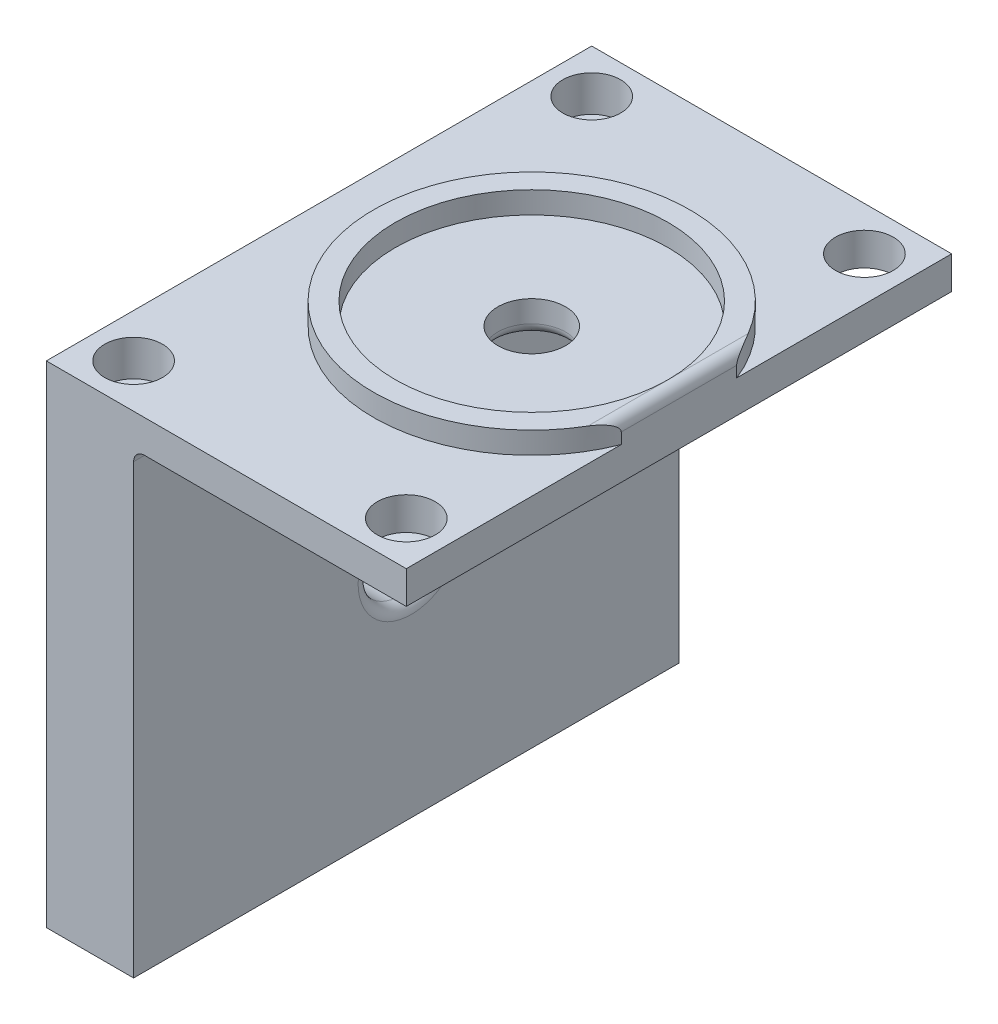
ISO-10303-21;
HEADER;
FILE_DESCRIPTION(('STEP AP214'),'2;1');
FILE_NAME('part.step','',(''),(''),'','','');
FILE_SCHEMA(('AUTOMOTIVE_DESIGN { 1 0 10303 214 1 1 1 1 }'));
ENDSEC;
DATA;
#1=APPLICATION_CONTEXT('core data for automotive mechanical design processes');
#2=APPLICATION_PROTOCOL_DEFINITION('international standard','automotive_design',2000,#1);
#3=PRODUCT_CONTEXT('',#1,'mechanical');
#4=PRODUCT('Part','Part','',(#3));
#5=PRODUCT_RELATED_PRODUCT_CATEGORY('part','',(#4));
#6=PRODUCT_DEFINITION_FORMATION('','',#4);
#7=PRODUCT_DEFINITION_CONTEXT('part definition',#1,'design');
#8=PRODUCT_DEFINITION('design','',#6,#7);
#9=PRODUCT_DEFINITION_SHAPE('','',#8);
#10=(LENGTH_UNIT() NAMED_UNIT(*) SI_UNIT(.MILLI.,.METRE.));
#11=(NAMED_UNIT(*) PLANE_ANGLE_UNIT() SI_UNIT($,.RADIAN.));
#12=(NAMED_UNIT(*) SI_UNIT($,.STERADIAN.) SOLID_ANGLE_UNIT());
#13=UNCERTAINTY_MEASURE_WITH_UNIT(LENGTH_MEASURE(1.E-05),#10,'distance_accuracy_value','');
#14=(GEOMETRIC_REPRESENTATION_CONTEXT(3) GLOBAL_UNCERTAINTY_ASSIGNED_CONTEXT((#13)) GLOBAL_UNIT_ASSIGNED_CONTEXT((#10,
#11,#12)) REPRESENTATION_CONTEXT('',''));
#15=CARTESIAN_POINT('',(0.,0.,0.));
#16=DIRECTION('',(0.,0.,1.));
#17=DIRECTION('',(1.,0.,0.));
#18=AXIS2_PLACEMENT_3D('',#15,#16,#17);
#19=CARTESIAN_POINT('',(0.,3.,0.));
#20=DIRECTION('',(0.,1.,0.));
#21=DIRECTION('',(0.,0.,1.));
#22=AXIS2_PLACEMENT_3D('',#19,#20,#21);
#23=PLANE('',#22);
#24=CARTESIAN_POINT('',(1.27695167286245,3.,-11.3847583643123));
#25=DIRECTION('',(0.,1.,0.));
#26=DIRECTION('',(0.,0.,1.));
#27=AXIS2_PLACEMENT_3D('',#24,#25,#26);
#28=CIRCLE('',#27,3.1);
#29=CARTESIAN_POINT('',(1.27695167286245,3.,-8.28475836431227));
#30=VERTEX_POINT('',#29);
#31=EDGE_CURVE('E243',#30,#30,#28,.T.);
#32=ORIENTED_EDGE('',*,*,#31,.F.);
#33=EDGE_LOOP('',(#32));
#34=FACE_BOUND('',#33,.T.);
#35=CARTESIAN_POINT('',(1.27695167286245,3.,-11.3847583643123));
#36=DIRECTION('',(0.,1.,0.));
#37=DIRECTION('',(0.,0.,1.));
#38=AXIS2_PLACEMENT_3D('',#35,#36,#37);
#39=CIRCLE('',#38,12.5);
#40=CARTESIAN_POINT('',(1.27695167286245,3.,1.11524163568773));
#41=VERTEX_POINT('',#40);
#42=EDGE_CURVE('E146',#41,#41,#39,.T.);
#43=ORIENTED_EDGE('',*,*,#42,.T.);
#44=EDGE_LOOP('',(#43));
#45=FACE_BOUND('',#44,.T.);
#46=ADVANCED_FACE('F41',(#34,#45),#23,.T.);
#47=CARTESIAN_POINT('',(0.,0.,0.));
#48=DIRECTION('',(0.,1.,0.));
#49=DIRECTION('',(0.,0.,1.));
#50=AXIS2_PLACEMENT_3D('',#47,#48,#49);
#51=PLANE('',#50);
#52=CARTESIAN_POINT('',(10.7769516728624,0.,-32.3847583643123));
#53=DIRECTION('',(0.,1.,0.));
#54=DIRECTION('',(0.,0.,1.));
#55=AXIS2_PLACEMENT_3D('',#52,#53,#54);
#56=CIRCLE('',#55,2.65);
#57=CARTESIAN_POINT('',(10.7769516728624,0.,-29.7347583643123));
#58=VERTEX_POINT('',#57);
#59=EDGE_CURVE('E170',#58,#58,#56,.F.);
#60=ORIENTED_EDGE('',*,*,#59,.F.);
#61=EDGE_LOOP('',(#60));
#62=FACE_BOUND('',#61,.T.);
#63=CARTESIAN_POINT('',(10.7769516728625,0.,9.61524163568773));
#64=DIRECTION('',(0.,1.,0.));
#65=DIRECTION('',(0.,0.,1.));
#66=AXIS2_PLACEMENT_3D('',#63,#64,#65);
#67=CIRCLE('',#66,2.65);
#68=CARTESIAN_POINT('',(10.7769516728625,0.,12.2652416356877));
#69=VERTEX_POINT('',#68);
#70=EDGE_CURVE('E163',#69,#69,#67,.F.);
#71=ORIENTED_EDGE('',*,*,#70,.F.);
#72=EDGE_LOOP('',(#71));
#73=FACE_BOUND('',#72,.T.);
#74=CARTESIAN_POINT('',(1.27695167286245,0.,-11.3847583643123));
#75=DIRECTION('',(0.,1.,0.));
#76=DIRECTION('',(0.,0.,1.));
#77=AXIS2_PLACEMENT_3D('',#74,#75,#76);
#78=CIRCLE('',#77,4.1);
#79=CARTESIAN_POINT('',(1.27695167286245,0.,-7.28475836431227));
#80=VERTEX_POINT('',#79);
#81=EDGE_CURVE('E268',#80,#80,#78,.T.);
#82=ORIENTED_EDGE('',*,*,#81,.T.);
#83=EDGE_LOOP('',(#82));
#84=FACE_BOUND('',#83,.T.);
#85=DIRECTION('',(1.,0.,0.));
#86=VECTOR('',#85,1.);
#87=CARTESIAN_POINT('',(-10.2230483271375,0.,13.6152416356877));
#88=LINE('',#87,#86);
#89=CARTESIAN_POINT('',(-9.22304832713755,0.,13.6152416356877));
#90=VERTEX_POINT('',#89);
#91=CARTESIAN_POINT('',(14.7769516728625,0.,13.6152416356877));
#92=VERTEX_POINT('',#91);
#93=EDGE_CURVE('E247',#90,#92,#88,.T.);
#94=ORIENTED_EDGE('',*,*,#93,.F.);
#95=DIRECTION('',(0.,0.,1.));
#96=VECTOR('',#95,1.);
#97=CARTESIAN_POINT('',(-9.22304832713755,0.,-36.3847583643123));
#98=LINE('',#97,#96);
#99=CARTESIAN_POINT('',(-9.22304832713755,0.,-36.3847583643123));
#100=VERTEX_POINT('',#99);
#101=EDGE_CURVE('E288',#90,#100,#98,.F.);
#102=ORIENTED_EDGE('',*,*,#101,.T.);
#103=DIRECTION('',(-1.,0.,0.));
#104=VECTOR('',#103,1.);
#105=CARTESIAN_POINT('',(-10.2230483271376,0.,-36.3847583643123));
#106=LINE('',#105,#104);
#107=CARTESIAN_POINT('',(14.7769516728625,0.,-36.3847583643123));
#108=VERTEX_POINT('',#107);
#109=EDGE_CURVE('E249',#108,#100,#106,.T.);
#110=ORIENTED_EDGE('',*,*,#109,.F.);
#111=DIRECTION('',(0.,0.,-1.));
#112=VECTOR('',#111,1.);
#113=CARTESIAN_POINT('',(14.7769516728625,0.,-36.3847583643123));
#114=LINE('',#113,#112);
#115=EDGE_CURVE('E256',#92,#108,#114,.T.);
#116=ORIENTED_EDGE('',*,*,#115,.F.);
#117=EDGE_LOOP('',(#94,#102,#110,#116));
#118=FACE_BOUND('',#117,.T.);
#119=ADVANCED_FACE('F391',(#62,#73,#84,#118),#51,.F.);
#120=CARTESIAN_POINT('',(1.27695167286245,3.,-11.3847583643123));
#121=DIRECTION('',(0.,1.,0.));
#122=DIRECTION('',(0.,0.,1.));
#123=AXIS2_PLACEMENT_3D('',#120,#121,#122);
#124=CIRCLE('',#123,14.5);
#125=CARTESIAN_POINT('',(14.7769516728625,3.,-16.6762609864415));
#126=VERTEX_POINT('',#125);
#127=CARTESIAN_POINT('',(14.7769516728625,3.,-6.0932557421831));
#128=VERTEX_POINT('',#127);
#129=EDGE_CURVE('E134',#126,#128,#124,.T.);
#130=ORIENTED_EDGE('',*,*,#129,.F.);
#131=DIRECTION('',(0.,0.,-1.));
#132=VECTOR('',#131,1.);
#133=CARTESIAN_POINT('',(14.7769516728625,3.,-36.3847583643123));
#134=LINE('',#133,#132);
#135=CARTESIAN_POINT('',(14.7769516728625,3.,-36.3847583643123));
#136=VERTEX_POINT('',#135);
#137=EDGE_CURVE('E141',#126,#136,#134,.T.);
#138=ORIENTED_EDGE('',*,*,#137,.T.);
#139=DIRECTION('',(-1.,0.,0.));
#140=VECTOR('',#139,1.);
#141=CARTESIAN_POINT('',(-10.2230483271376,3.,-36.3847583643123));
#142=LINE('',#141,#140);
#143=CARTESIAN_POINT('',(-18.2230483271376,3.,-36.3847583643123));
#144=VERTEX_POINT('',#143);
#145=EDGE_CURVE('E140',#136,#144,#142,.T.);
#146=ORIENTED_EDGE('',*,*,#145,.T.);
#147=DIRECTION('',(0.,0.,-1.));
#148=VECTOR('',#147,1.);
#149=CARTESIAN_POINT('',(-18.2230483271376,3.,-36.3847583643123));
#150=LINE('',#149,#148);
#151=CARTESIAN_POINT('',(-18.2230483271375,3.,13.6152416356877));
#152=VERTEX_POINT('',#151);
#153=EDGE_CURVE('E239',#152,#144,#150,.T.);
#154=ORIENTED_EDGE('',*,*,#153,.F.);
#155=DIRECTION('',(1.,0.,0.));
#156=VECTOR('',#155,1.);
#157=CARTESIAN_POINT('',(-10.2230483271375,3.,13.6152416356877));
#158=LINE('',#157,#156);
#159=CARTESIAN_POINT('',(14.7769516728625,3.,13.6152416356877));
#160=VERTEX_POINT('',#159);
#161=EDGE_CURVE('E137',#152,#160,#158,.T.);
#162=ORIENTED_EDGE('',*,*,#161,.T.);
#163=EDGE_CURVE('E123',#160,#128,#134,.T.);
#164=ORIENTED_EDGE('',*,*,#163,.T.);
#165=EDGE_LOOP('',(#130,#138,#146,#154,#162,#164));
#166=FACE_BOUND('',#165,.T.);
#167=CARTESIAN_POINT('',(10.7769516728624,3.,-32.3847583643123));
#168=DIRECTION('',(0.,-1.,0.));
#169=DIRECTION('',(0.,0.,1.));
#170=AXIS2_PLACEMENT_3D('',#167,#168,#169);
#171=CIRCLE('',#170,2.65);
#172=CARTESIAN_POINT('',(10.7769516728624,3.,-29.7347583643123));
#173=VERTEX_POINT('',#172);
#174=EDGE_CURVE('E159',#173,#173,#171,.T.);
#175=ORIENTED_EDGE('',*,*,#174,.T.);
#176=EDGE_LOOP('',(#175));
#177=FACE_BOUND('',#176,.T.);
#178=CARTESIAN_POINT('',(10.7769516728625,3.,9.61524163568773));
#179=DIRECTION('',(0.,-1.,0.));
#180=DIRECTION('',(0.,0.,1.));
#181=AXIS2_PLACEMENT_3D('',#178,#179,#180);
#182=CIRCLE('',#181,2.65);
#183=CARTESIAN_POINT('',(10.7769516728625,3.,12.2652416356877));
#184=VERTEX_POINT('',#183);
#185=EDGE_CURVE('E158',#184,#184,#182,.T.);
#186=ORIENTED_EDGE('',*,*,#185,.T.);
#187=EDGE_LOOP('',(#186));
#188=FACE_BOUND('',#187,.T.);
#189=CARTESIAN_POINT('',(-14.2230483271375,3.,-32.3847583643123));
#190=DIRECTION('',(0.,1.,0.));
#191=DIRECTION('',(0.,0.,1.));
#192=AXIS2_PLACEMENT_3D('',#189,#190,#191);
#193=CIRCLE('',#192,2.65);
#194=CARTESIAN_POINT('',(-14.2230483271375,3.,-29.7347583643123));
#195=VERTEX_POINT('',#194);
#196=EDGE_CURVE('E200',#195,#195,#193,.T.);
#197=ORIENTED_EDGE('',*,*,#196,.F.);
#198=EDGE_LOOP('',(#197));
#199=FACE_BOUND('',#198,.T.);
#200=CARTESIAN_POINT('',(-14.2230483271375,3.,9.61524163568773));
#201=DIRECTION('',(0.,1.,0.));
#202=DIRECTION('',(0.,0.,1.));
#203=AXIS2_PLACEMENT_3D('',#200,#201,#202);
#204=CIRCLE('',#203,2.65);
#205=CARTESIAN_POINT('',(-14.2230483271375,3.,12.2652416356877));
#206=VERTEX_POINT('',#205);
#207=EDGE_CURVE('E183',#206,#206,#204,.T.);
#208=ORIENTED_EDGE('',*,*,#207,.F.);
#209=EDGE_LOOP('',(#208));
#210=FACE_BOUND('',#209,.T.);
#211=ADVANCED_FACE('F132',(#166,#177,#188,#199,#210),#23,.T.);
#212=CARTESIAN_POINT('',(-10.2230483271375,3.,13.6152416356877));
#213=DIRECTION('',(0.,0.,-1.));
#214=DIRECTION('',(-1.,0.,0.));
#215=AXIS2_PLACEMENT_3D('',#212,#213,#214);
#216=PLANE('',#215);
#217=DIRECTION('',(0.,1.,0.));
#218=VECTOR('',#217,1.);
#219=CARTESIAN_POINT('',(-18.2230483271375,3.,13.6152416356877));
#220=LINE('',#219,#218);
#221=CARTESIAN_POINT('',(-18.2230483271376,-42.,13.6152416356877));
#222=VERTEX_POINT('',#221);
#223=EDGE_CURVE('E235',#222,#152,#220,.T.);
#224=ORIENTED_EDGE('',*,*,#223,.F.);
#225=DIRECTION('',(-1.,0.,0.));
#226=VECTOR('',#225,1.);
#227=CARTESIAN_POINT('',(-18.2230483271376,-42.,13.6152416356877));
#228=LINE('',#227,#226);
#229=CARTESIAN_POINT('',(-10.2230483271376,-42.,13.6152416356877));
#230=VERTEX_POINT('',#229);
#231=EDGE_CURVE('E220',#230,#222,#228,.T.);
#232=ORIENTED_EDGE('',*,*,#231,.F.);
#233=DIRECTION('',(0.,1.,0.));
#234=VECTOR('',#233,1.);
#235=CARTESIAN_POINT('',(-10.2230483271376,-42.,13.6152416356877));
#236=LINE('',#235,#234);
#237=CARTESIAN_POINT('',(-10.2230483271376,-1.00000000000001,13.6152416356877));
#238=VERTEX_POINT('',#237);
#239=EDGE_CURVE('E224',#230,#238,#236,.T.);
#240=ORIENTED_EDGE('',*,*,#239,.T.);
#241=CARTESIAN_POINT('',(-9.22304832713755,-1.,13.6152416356877));
#242=DIRECTION('',(0.,0.,-1.));
#243=DIRECTION('',(-1.,0.,0.));
#244=AXIS2_PLACEMENT_3D('',#241,#242,#243);
#245=CIRCLE('',#244,1.);
#246=EDGE_CURVE('E291',#238,#90,#245,.T.);
#247=ORIENTED_EDGE('',*,*,#246,.T.);
#248=ORIENTED_EDGE('',*,*,#93,.T.);
#249=DIRECTION('',(0.,-1.,0.));
#250=VECTOR('',#249,1.);
#251=CARTESIAN_POINT('',(14.7769516728625,3.,13.6152416356877));
#252=LINE('',#251,#250);
#253=EDGE_CURVE('E265',#160,#92,#252,.T.);
#254=ORIENTED_EDGE('',*,*,#253,.F.);
#255=ORIENTED_EDGE('',*,*,#161,.F.);
#256=EDGE_LOOP('',(#224,#232,#240,#247,#248,#254,#255));
#257=FACE_BOUND('',#256,.T.);
#258=ADVANCED_FACE('F390',(#257),#216,.F.);
#259=CARTESIAN_POINT('',(14.7769516728625,3.,-36.3847583643123));
#260=DIRECTION('',(-1.,0.,0.));
#261=DIRECTION('',(0.,0.,1.));
#262=AXIS2_PLACEMENT_3D('',#259,#260,#261);
#263=PLANE('',#262);
#264=DIRECTION('',(0.,-1.,0.));
#265=VECTOR('',#264,1.);
#266=CARTESIAN_POINT('',(14.7769516728625,5.,-16.6762609864414));
#267=LINE('',#266,#265);
#268=CARTESIAN_POINT('',(14.7769516728625,4.,-16.6762609864414));
#269=VERTEX_POINT('',#268);
#270=EDGE_CURVE('E127',#269,#126,#267,.T.);
#271=ORIENTED_EDGE('',*,*,#270,.F.);
#272=DIRECTION('',(0.,0.,-1.));
#273=VECTOR('',#272,1.);
#274=CARTESIAN_POINT('',(14.7769516728625,4.,-6.0932557421831));
#275=LINE('',#274,#273);
#276=CARTESIAN_POINT('',(14.7769516728625,4.,-6.0932557421831));
#277=VERTEX_POINT('',#276);
#278=EDGE_CURVE('E11',#269,#277,#275,.F.);
#279=ORIENTED_EDGE('',*,*,#278,.T.);
#280=DIRECTION('',(0.,-1.,0.));
#281=VECTOR('',#280,1.);
#282=CARTESIAN_POINT('',(14.7769516728625,5.,-6.0932557421831));
#283=LINE('',#282,#281);
#284=EDGE_CURVE('E119',#277,#128,#283,.T.);
#285=ORIENTED_EDGE('',*,*,#284,.T.);
#286=ORIENTED_EDGE('',*,*,#163,.F.);
#287=ORIENTED_EDGE('',*,*,#253,.T.);
#288=ORIENTED_EDGE('',*,*,#115,.T.);
#289=DIRECTION('',(0.,-1.,0.));
#290=VECTOR('',#289,1.);
#291=CARTESIAN_POINT('',(14.7769516728625,3.,-36.3847583643123));
#292=LINE('',#291,#290);
#293=EDGE_CURVE('E253',#136,#108,#292,.T.);
#294=ORIENTED_EDGE('',*,*,#293,.F.);
#295=ORIENTED_EDGE('',*,*,#137,.F.);
#296=EDGE_LOOP('',(#271,#279,#285,#286,#287,#288,#294,#295));
#297=FACE_BOUND('',#296,.T.);
#298=ADVANCED_FACE('F121',(#297),#263,.F.);
#299=CARTESIAN_POINT('',(-10.2230483271376,3.,-36.3847583643123));
#300=DIRECTION('',(0.,0.,1.));
#301=DIRECTION('',(1.,0.,0.));
#302=AXIS2_PLACEMENT_3D('',#299,#300,#301);
#303=PLANE('',#302);
#304=ORIENTED_EDGE('',*,*,#109,.T.);
#305=CARTESIAN_POINT('',(-9.22304832713755,-1.,-36.3847583643123));
#306=DIRECTION('',(0.,0.,1.));
#307=DIRECTION('',(1.,0.,0.));
#308=AXIS2_PLACEMENT_3D('',#305,#306,#307);
#309=CIRCLE('',#308,1.);
#310=CARTESIAN_POINT('',(-10.2230483271376,-1.00000000000001,-36.3847583643123));
#311=VERTEX_POINT('',#310);
#312=EDGE_CURVE('E294',#100,#311,#309,.T.);
#313=ORIENTED_EDGE('',*,*,#312,.T.);
#314=DIRECTION('',(0.,1.,0.));
#315=VECTOR('',#314,1.);
#316=CARTESIAN_POINT('',(-10.2230483271376,-42.,-36.3847583643123));
#317=LINE('',#316,#315);
#318=CARTESIAN_POINT('',(-10.2230483271376,-42.,-36.3847583643123));
#319=VERTEX_POINT('',#318);
#320=EDGE_CURVE('E228',#319,#311,#317,.T.);
#321=ORIENTED_EDGE('',*,*,#320,.F.);
#322=DIRECTION('',(1.,0.,0.));
#323=VECTOR('',#322,1.);
#324=CARTESIAN_POINT('',(-18.2230483271376,-42.,-36.3847583643123));
#325=LINE('',#324,#323);
#326=CARTESIAN_POINT('',(-18.2230483271376,-42.,-36.3847583643123));
#327=VERTEX_POINT('',#326);
#328=EDGE_CURVE('E214',#327,#319,#325,.T.);
#329=ORIENTED_EDGE('',*,*,#328,.F.);
#330=DIRECTION('',(0.,-1.,0.));
#331=VECTOR('',#330,1.);
#332=CARTESIAN_POINT('',(-18.2230483271376,3.,-36.3847583643123));
#333=LINE('',#332,#331);
#334=EDGE_CURVE('E232',#144,#327,#333,.T.);
#335=ORIENTED_EDGE('',*,*,#334,.F.);
#336=ORIENTED_EDGE('',*,*,#145,.F.);
#337=ORIENTED_EDGE('',*,*,#293,.T.);
#338=EDGE_LOOP('',(#304,#313,#321,#329,#335,#336,#337));
#339=FACE_BOUND('',#338,.T.);
#340=ADVANCED_FACE('F386',(#339),#303,.F.);
#341=CARTESIAN_POINT('',(1.27695167286245,3.,-11.3847583643123));
#342=DIRECTION('',(0.,-1.,0.));
#343=DIRECTION('',(0.,0.,-1.));
#344=AXIS2_PLACEMENT_3D('',#341,#342,#343);
#345=CYLINDRICAL_SURFACE('',#344,3.1);
#346=CARTESIAN_POINT('',(1.27695167286245,1.,-11.3847583643123));
#347=DIRECTION('',(0.,1.,0.));
#348=DIRECTION('',(0.,0.,1.));
#349=AXIS2_PLACEMENT_3D('',#346,#347,#348);
#350=CIRCLE('',#349,3.1);
#351=CARTESIAN_POINT('',(1.27695167286245,1.,-8.28475836431227));
#352=VERTEX_POINT('',#351);
#353=EDGE_CURVE('E272',#352,#352,#350,.F.);
#354=ORIENTED_EDGE('',*,*,#353,.T.);
#355=EDGE_LOOP('',(#354));
#356=FACE_BOUND('',#355,.T.);
#357=ORIENTED_EDGE('',*,*,#31,.T.);
#358=EDGE_LOOP('',(#357));
#359=FACE_BOUND('',#358,.T.);
#360=ADVANCED_FACE('F382',(#356,#359),#345,.F.);
#361=CARTESIAN_POINT('',(-18.2230483271375,0.,0.));
#362=DIRECTION('',(-1.,0.,0.));
#363=DIRECTION('',(0.,0.,1.));
#364=AXIS2_PLACEMENT_3D('',#361,#362,#363);
#365=PLANE('',#364);
#366=CARTESIAN_POINT('',(-18.2230483271375,-21.,-11.836279123996));
#367=DIRECTION('',(-1.,0.,0.));
#368=DIRECTION('',(0.,0.,1.));
#369=AXIS2_PLACEMENT_3D('',#366,#367,#368);
#370=CIRCLE('',#369,3.8682468035705);
#371=CARTESIAN_POINT('',(-18.2230483271375,-21.,-7.96803232042551));
#372=VERTEX_POINT('',#371);
#373=EDGE_CURVE('E174',#372,#372,#370,.T.);
#374=ORIENTED_EDGE('',*,*,#373,.F.);
#375=EDGE_LOOP('',(#374));
#376=FACE_BOUND('',#375,.T.);
#377=ORIENTED_EDGE('',*,*,#334,.T.);
#378=DIRECTION('',(0.,0.,-1.));
#379=VECTOR('',#378,1.);
#380=CARTESIAN_POINT('',(-18.2230483271376,-42.,-36.3847583643123));
#381=LINE('',#380,#379);
#382=EDGE_CURVE('E199',#222,#327,#381,.T.);
#383=ORIENTED_EDGE('',*,*,#382,.F.);
#384=ORIENTED_EDGE('',*,*,#223,.T.);
#385=ORIENTED_EDGE('',*,*,#153,.T.);
#386=EDGE_LOOP('',(#377,#383,#384,#385));
#387=FACE_BOUND('',#386,.T.);
#388=ADVANCED_FACE('F378',(#376,#387),#365,.T.);
#389=CARTESIAN_POINT('',(-10.2230483271376,-42.,-36.3847583643123));
#390=DIRECTION('',(-1.,0.,0.));
#391=DIRECTION('',(0.,0.,1.));
#392=AXIS2_PLACEMENT_3D('',#389,#390,#391);
#393=PLANE('',#392);
#394=CARTESIAN_POINT('',(-10.2230483271376,-21.,-11.836279123996));
#395=DIRECTION('',(-1.,0.,0.));
#396=DIRECTION('',(0.,0.,1.));
#397=AXIS2_PLACEMENT_3D('',#394,#395,#396);
#398=CIRCLE('',#397,4.86824680357049);
#399=CARTESIAN_POINT('',(-10.2230483271376,-21.,-6.96803232042551));
#400=VERTEX_POINT('',#399);
#401=EDGE_CURVE('E276',#400,#400,#398,.T.);
#402=ORIENTED_EDGE('',*,*,#401,.T.);
#403=EDGE_LOOP('',(#402));
#404=FACE_BOUND('',#403,.T.);
#405=ORIENTED_EDGE('',*,*,#320,.T.);
#406=DIRECTION('',(0.,0.,1.));
#407=VECTOR('',#406,1.);
#408=CARTESIAN_POINT('',(-10.2230483271376,-1.,13.6152416356877));
#409=LINE('',#408,#407);
#410=EDGE_CURVE('E284',#311,#238,#409,.T.);
#411=ORIENTED_EDGE('',*,*,#410,.T.);
#412=ORIENTED_EDGE('',*,*,#239,.F.);
#413=DIRECTION('',(0.,0.,1.));
#414=VECTOR('',#413,1.);
#415=CARTESIAN_POINT('',(-10.2230483271376,-42.,-36.3847583643123));
#416=LINE('',#415,#414);
#417=EDGE_CURVE('E217',#319,#230,#416,.T.);
#418=ORIENTED_EDGE('',*,*,#417,.F.);
#419=EDGE_LOOP('',(#405,#411,#412,#418));
#420=FACE_BOUND('',#419,.T.);
#421=ADVANCED_FACE('F374',(#404,#420),#393,.F.);
#422=CARTESIAN_POINT('',(0.,-42.,0.));
#423=DIRECTION('',(0.,1.,0.));
#424=DIRECTION('',(0.,0.,1.));
#425=AXIS2_PLACEMENT_3D('',#422,#423,#424);
#426=PLANE('',#425);
#427=CARTESIAN_POINT('',(-14.2230483271375,-42.,-32.3847583643123));
#428=DIRECTION('',(0.,1.,0.));
#429=DIRECTION('',(0.,0.,1.));
#430=AXIS2_PLACEMENT_3D('',#427,#428,#429);
#431=CIRCLE('',#430,2.65);
#432=CARTESIAN_POINT('',(-14.2230483271375,-42.,-29.7347583643123));
#433=VERTEX_POINT('',#432);
#434=EDGE_CURVE('E184',#433,#433,#431,.T.);
#435=ORIENTED_EDGE('',*,*,#434,.T.);
#436=EDGE_LOOP('',(#435));
#437=FACE_BOUND('',#436,.T.);
#438=CARTESIAN_POINT('',(-14.2230483271375,-42.,9.61524163568773));
#439=DIRECTION('',(0.,1.,0.));
#440=DIRECTION('',(0.,0.,1.));
#441=AXIS2_PLACEMENT_3D('',#438,#439,#440);
#442=CIRCLE('',#441,2.65);
#443=CARTESIAN_POINT('',(-14.2230483271375,-42.,12.2652416356877));
#444=VERTEX_POINT('',#443);
#445=EDGE_CURVE('E178',#444,#444,#442,.T.);
#446=ORIENTED_EDGE('',*,*,#445,.T.);
#447=EDGE_LOOP('',(#446));
#448=FACE_BOUND('',#447,.T.);
#449=ORIENTED_EDGE('',*,*,#382,.T.);
#450=ORIENTED_EDGE('',*,*,#328,.T.);
#451=ORIENTED_EDGE('',*,*,#417,.T.);
#452=ORIENTED_EDGE('',*,*,#231,.T.);
#453=EDGE_LOOP('',(#449,#450,#451,#452));
#454=FACE_BOUND('',#453,.T.);
#455=ADVANCED_FACE('F370',(#437,#448,#454),#426,.F.);
#456=CARTESIAN_POINT('',(-14.2230483271375,-0.3,9.61524163568773));
#457=DIRECTION('',(0.,1.,0.));
#458=DIRECTION('',(0.,0.,1.));
#459=AXIS2_PLACEMENT_3D('',#456,#457,#458);
#460=CYLINDRICAL_SURFACE('',#459,2.65);
#461=CARTESIAN_POINT('',(-14.2230483271375,-0.3,9.61524163568773));
#462=DIRECTION('',(0.,1.,0.));
#463=DIRECTION('',(0.,0.,1.));
#464=AXIS2_PLACEMENT_3D('',#461,#462,#463);
#465=CIRCLE('',#464,2.65);
#466=CARTESIAN_POINT('',(-14.2230483271375,-0.3,12.2652416356877));
#467=VERTEX_POINT('',#466);
#468=EDGE_CURVE('E204',#467,#467,#465,.T.);
#469=ORIENTED_EDGE('',*,*,#468,.F.);
#470=EDGE_LOOP('',(#469));
#471=FACE_BOUND('',#470,.T.);
#472=ORIENTED_EDGE('',*,*,#207,.T.);
#473=EDGE_LOOP('',(#472));
#474=FACE_BOUND('',#473,.T.);
#475=ADVANCED_FACE('F366',(#471,#474),#460,.F.);
#476=CARTESIAN_POINT('',(-14.2230483271375,-0.3,9.61524163568773));
#477=DIRECTION('',(0.,1.,0.));
#478=DIRECTION('',(0.,0.,1.));
#479=AXIS2_PLACEMENT_3D('',#476,#477,#478);
#480=PLANE('',#479);
#481=ORIENTED_EDGE('',*,*,#468,.T.);
#482=EDGE_LOOP('',(#481));
#483=FACE_BOUND('',#482,.T.);
#484=ADVANCED_FACE('F362',(#483),#480,.T.);
#485=CARTESIAN_POINT('',(-14.2230483271375,-0.3,-32.3847583643123));
#486=DIRECTION('',(0.,1.,0.));
#487=DIRECTION('',(0.,0.,1.));
#488=AXIS2_PLACEMENT_3D('',#485,#486,#487);
#489=CYLINDRICAL_SURFACE('',#488,2.65);
#490=CARTESIAN_POINT('',(-14.2230483271375,-0.3,-32.3847583643123));
#491=DIRECTION('',(0.,1.,0.));
#492=DIRECTION('',(0.,0.,1.));
#493=AXIS2_PLACEMENT_3D('',#490,#491,#492);
#494=CIRCLE('',#493,2.65);
#495=CARTESIAN_POINT('',(-14.2230483271375,-0.3,-29.7347583643123));
#496=VERTEX_POINT('',#495);
#497=EDGE_CURVE('E195',#496,#496,#494,.T.);
#498=ORIENTED_EDGE('',*,*,#497,.F.);
#499=EDGE_LOOP('',(#498));
#500=FACE_BOUND('',#499,.T.);
#501=ORIENTED_EDGE('',*,*,#196,.T.);
#502=EDGE_LOOP('',(#501));
#503=FACE_BOUND('',#502,.T.);
#504=ADVANCED_FACE('F358',(#500,#503),#489,.F.);
#505=CARTESIAN_POINT('',(-14.2230483271375,-0.3,-32.3847583643123));
#506=DIRECTION('',(0.,1.,0.));
#507=DIRECTION('',(0.,0.,1.));
#508=AXIS2_PLACEMENT_3D('',#505,#506,#507);
#509=PLANE('',#508);
#510=ORIENTED_EDGE('',*,*,#497,.T.);
#511=EDGE_LOOP('',(#510));
#512=FACE_BOUND('',#511,.T.);
#513=ADVANCED_FACE('F354',(#512),#509,.T.);
#514=CARTESIAN_POINT('',(-14.2230483271375,-38.7,9.61524163568773));
#515=DIRECTION('',(0.,-1.,0.));
#516=DIRECTION('',(0.,0.,-1.));
#517=AXIS2_PLACEMENT_3D('',#514,#515,#516);
#518=CYLINDRICAL_SURFACE('',#517,2.65);
#519=CARTESIAN_POINT('',(-14.2230483271375,-38.7,9.61524163568773));
#520=DIRECTION('',(0.,1.,0.));
#521=DIRECTION('',(0.,0.,1.));
#522=AXIS2_PLACEMENT_3D('',#519,#520,#521);
#523=CIRCLE('',#522,2.65);
#524=CARTESIAN_POINT('',(-14.2230483271375,-38.7,12.2652416356877));
#525=VERTEX_POINT('',#524);
#526=EDGE_CURVE('E188',#525,#525,#523,.T.);
#527=ORIENTED_EDGE('',*,*,#526,.T.);
#528=EDGE_LOOP('',(#527));
#529=FACE_BOUND('',#528,.T.);
#530=ORIENTED_EDGE('',*,*,#445,.F.);
#531=EDGE_LOOP('',(#530));
#532=FACE_BOUND('',#531,.T.);
#533=ADVANCED_FACE('F350',(#529,#532),#518,.F.);
#534=CARTESIAN_POINT('',(-14.2230483271375,-38.7,9.61524163568773));
#535=DIRECTION('',(0.,-1.,0.));
#536=DIRECTION('',(0.,0.,1.));
#537=AXIS2_PLACEMENT_3D('',#534,#535,#536);
#538=PLANE('',#537);
#539=ORIENTED_EDGE('',*,*,#526,.F.);
#540=EDGE_LOOP('',(#539));
#541=FACE_BOUND('',#540,.T.);
#542=ADVANCED_FACE('F346',(#541),#538,.T.);
#543=CARTESIAN_POINT('',(-14.2230483271375,-38.7,-32.3847583643123));
#544=DIRECTION('',(0.,-1.,0.));
#545=DIRECTION('',(0.,0.,-1.));
#546=AXIS2_PLACEMENT_3D('',#543,#544,#545);
#547=CYLINDRICAL_SURFACE('',#546,2.65);
#548=CARTESIAN_POINT('',(-14.2230483271375,-38.7,-32.3847583643123));
#549=DIRECTION('',(0.,1.,0.));
#550=DIRECTION('',(0.,0.,1.));
#551=AXIS2_PLACEMENT_3D('',#548,#549,#550);
#552=CIRCLE('',#551,2.65);
#553=CARTESIAN_POINT('',(-14.2230483271375,-38.7,-29.7347583643123));
#554=VERTEX_POINT('',#553);
#555=EDGE_CURVE('E179',#554,#554,#552,.T.);
#556=ORIENTED_EDGE('',*,*,#555,.T.);
#557=EDGE_LOOP('',(#556));
#558=FACE_BOUND('',#557,.T.);
#559=ORIENTED_EDGE('',*,*,#434,.F.);
#560=EDGE_LOOP('',(#559));
#561=FACE_BOUND('',#560,.T.);
#562=ADVANCED_FACE('F342',(#558,#561),#547,.F.);
#563=CARTESIAN_POINT('',(-14.2230483271375,-38.7,-32.3847583643123));
#564=DIRECTION('',(0.,-1.,0.));
#565=DIRECTION('',(0.,0.,1.));
#566=AXIS2_PLACEMENT_3D('',#563,#564,#565);
#567=PLANE('',#566);
#568=ORIENTED_EDGE('',*,*,#555,.F.);
#569=EDGE_LOOP('',(#568));
#570=FACE_BOUND('',#569,.T.);
#571=ADVANCED_FACE('F339',(#570),#567,.T.);
#572=CARTESIAN_POINT('',(1.27695167286245,1.,-11.3847583643123));
#573=DIRECTION('',(0.,1.,0.));
#574=DIRECTION('',(0.,0.,1.));
#575=AXIS2_PLACEMENT_3D('',#572,#573,#574);
#576=TOROIDAL_SURFACE('',#575,4.1,1.);
#577=ORIENTED_EDGE('',*,*,#353,.F.);
#578=EDGE_LOOP('',(#577));
#579=FACE_BOUND('',#578,.T.);
#580=ORIENTED_EDGE('',*,*,#81,.F.);
#581=EDGE_LOOP('',(#580));
#582=FACE_BOUND('',#581,.T.);
#583=ADVANCED_FACE('F337',(#579,#582),#576,.T.);
#584=CARTESIAN_POINT('',(-9.22304832713755,-21.,-11.836279123996));
#585=DIRECTION('',(-1.,0.,0.));
#586=DIRECTION('',(0.,0.,1.));
#587=AXIS2_PLACEMENT_3D('',#584,#585,#586);
#588=CYLINDRICAL_SURFACE('',#587,3.8682468035705);
#589=CARTESIAN_POINT('',(-11.2230483271376,-21.,-11.836279123996));
#590=DIRECTION('',(-1.,0.,0.));
#591=DIRECTION('',(0.,0.,1.));
#592=AXIS2_PLACEMENT_3D('',#589,#590,#591);
#593=CIRCLE('',#592,3.8682468035705);
#594=CARTESIAN_POINT('',(-11.2230483271376,-21.,-7.96803232042551));
#595=VERTEX_POINT('',#594);
#596=EDGE_CURVE('E280',#595,#595,#593,.F.);
#597=ORIENTED_EDGE('',*,*,#596,.T.);
#598=EDGE_LOOP('',(#597));
#599=FACE_BOUND('',#598,.T.);
#600=ORIENTED_EDGE('',*,*,#373,.T.);
#601=EDGE_LOOP('',(#600));
#602=FACE_BOUND('',#601,.T.);
#603=ADVANCED_FACE('F334',(#599,#602),#588,.F.);
#604=CARTESIAN_POINT('',(-11.2230483271376,-21.,-11.836279123996));
#605=DIRECTION('',(-1.,0.,0.));
#606=DIRECTION('',(0.,0.,1.));
#607=AXIS2_PLACEMENT_3D('',#604,#605,#606);
#608=TOROIDAL_SURFACE('',#607,4.86824680357049,1.);
#609=ORIENTED_EDGE('',*,*,#596,.F.);
#610=EDGE_LOOP('',(#609));
#611=FACE_BOUND('',#610,.T.);
#612=ORIENTED_EDGE('',*,*,#401,.F.);
#613=EDGE_LOOP('',(#612));
#614=FACE_BOUND('',#613,.T.);
#615=ADVANCED_FACE('F332',(#611,#614),#608,.T.);
#616=CARTESIAN_POINT('',(10.7769516728625,-0.3,9.61524163568773));
#617=DIRECTION('',(0.,1.,0.));
#618=DIRECTION('',(0.,0.,1.));
#619=AXIS2_PLACEMENT_3D('',#616,#617,#618);
#620=CYLINDRICAL_SURFACE('',#619,2.65);
#621=ORIENTED_EDGE('',*,*,#185,.F.);
#622=EDGE_LOOP('',(#621));
#623=FACE_BOUND('',#622,.T.);
#624=ORIENTED_EDGE('',*,*,#70,.T.);
#625=EDGE_LOOP('',(#624));
#626=FACE_BOUND('',#625,.T.);
#627=ADVANCED_FACE('F328',(#623,#626),#620,.F.);
#628=CARTESIAN_POINT('',(10.7769516728624,-0.3,-32.3847583643123));
#629=DIRECTION('',(0.,1.,0.));
#630=DIRECTION('',(0.,0.,1.));
#631=AXIS2_PLACEMENT_3D('',#628,#629,#630);
#632=CYLINDRICAL_SURFACE('',#631,2.65);
#633=ORIENTED_EDGE('',*,*,#174,.F.);
#634=EDGE_LOOP('',(#633));
#635=FACE_BOUND('',#634,.T.);
#636=ORIENTED_EDGE('',*,*,#59,.T.);
#637=EDGE_LOOP('',(#636));
#638=FACE_BOUND('',#637,.T.);
#639=ADVANCED_FACE('F324',(#635,#638),#632,.F.);
#640=CARTESIAN_POINT('',(1.27695167286245,5.,-11.3847583643123));
#641=DIRECTION('',(0.,-1.,0.));
#642=DIRECTION('',(0.,0.,-1.));
#643=AXIS2_PLACEMENT_3D('',#640,#641,#642);
#644=CYLINDRICAL_SURFACE('',#643,12.5);
#645=CARTESIAN_POINT('',(1.27695167286245,5.,-11.3847583643123));
#646=DIRECTION('',(0.,1.,0.));
#647=DIRECTION('',(0.,0.,1.));
#648=AXIS2_PLACEMENT_3D('',#645,#646,#647);
#649=CIRCLE('',#648,12.5);
#650=CARTESIAN_POINT('',(13.7769516728625,5.,-11.3847583643123));
#651=VERTEX_POINT('',#650);
#652=EDGE_CURVE('E145',#651,#651,#649,.T.);
#653=ORIENTED_EDGE('',*,*,#652,.T.);
#654=EDGE_LOOP('',(#653));
#655=FACE_BOUND('',#654,.T.);
#656=ORIENTED_EDGE('',*,*,#42,.F.);
#657=EDGE_LOOP('',(#656));
#658=FACE_BOUND('',#657,.T.);
#659=ADVANCED_FACE('F320',(#655,#658),#644,.F.);
#660=CARTESIAN_POINT('',(1.27695167286245,5.,-11.3847583643123));
#661=DIRECTION('',(0.,-1.,0.));
#662=DIRECTION('',(0.,0.,-1.));
#663=AXIS2_PLACEMENT_3D('',#660,#661,#662);
#664=CYLINDRICAL_SURFACE('',#663,14.5);
#665=CARTESIAN_POINT('',(1.27695167286245,5.,-11.3847583643123));
#666=DIRECTION('',(0.,1.,0.));
#667=DIRECTION('',(0.,0.,1.));
#668=AXIS2_PLACEMENT_3D('',#665,#666,#667);
#669=CIRCLE('',#668,14.5);
#670=CARTESIAN_POINT('',(13.7769516728625,5.,-18.7332275926618));
#671=VERTEX_POINT('',#670);
#672=CARTESIAN_POINT('',(13.7769516728625,5.,-4.03628913596274));
#673=VERTEX_POINT('',#672);
#674=EDGE_CURVE('E128',#671,#673,#669,.T.);
#675=ORIENTED_EDGE('',*,*,#674,.F.);
#676=CARTESIAN_POINT('',(13.7769516728625,5.,-18.7332275926618));
#677=CARTESIAN_POINT('',(13.8061141464169,4.99999449154705,-18.6836220816922));
#678=CARTESIAN_POINT('',(13.8349743998542,4.99872509822277,-18.6338528371027));
#679=CARTESIAN_POINT('',(13.8920474592475,4.99376830957608,-18.5340702030511));
#680=CARTESIAN_POINT('',(13.9202603324725,4.99008116666869,-18.4840568396163));
#681=CARTESIAN_POINT('',(14.0039674818749,4.97554080477307,-18.3335890674113));
#682=CARTESIAN_POINT('',(14.0584305613203,4.96120940560983,-18.2328766730217));
#683=CARTESIAN_POINT('',(14.1640438597545,4.92373430222118,-18.0319895928188));
#684=CARTESIAN_POINT('',(14.2152082150977,4.9006315957957,-17.931814571518));
#685=CARTESIAN_POINT('',(14.3141920717866,4.84533681639526,-17.7324126512781));
#686=CARTESIAN_POINT('',(14.3620152554512,4.8131549532352,-17.6331848160426));
#687=CARTESIAN_POINT('',(14.4345864725353,4.75411377500788,-17.4782461415));
#688=CARTESIAN_POINT('',(14.4605760429363,4.73071365055245,-17.4217946043335));
#689=CARTESIAN_POINT('',(14.5112269097921,4.67980424014433,-17.3099368184038));
#690=CARTESIAN_POINT('',(14.5358843928176,4.65228392806517,-17.2545338380622));
#691=CARTESIAN_POINT('',(14.5867754720504,4.5882938751465,-17.1382885222535));
#692=CARTESIAN_POINT('',(14.6127754710012,4.55111843120913,-17.0777159573401));
#693=CARTESIAN_POINT('',(14.6495380714809,4.48904145383137,-16.9905531043374));
#694=CARTESIAN_POINT('',(14.6614026075625,4.46733555878338,-16.9621562287386));
#695=CARTESIAN_POINT('',(14.6842017760944,4.42137552493057,-16.9071242592913));
#696=CARTESIAN_POINT('',(14.6951375389787,4.3971245665991,-16.8804870327681));
#697=CARTESIAN_POINT('',(14.7137404021336,4.35060508438718,-16.8348219269034));
#698=CARTESIAN_POINT('',(14.7216271093777,4.32888654646072,-16.8153285303678));
#699=CARTESIAN_POINT('',(14.7363398664156,4.28311157134351,-16.7787602542757));
#700=CARTESIAN_POINT('',(14.7431657578184,4.2590547858975,-16.7616857359169));
#701=CARTESIAN_POINT('',(14.7544656411555,4.21204547507311,-16.7332924663767));
#702=CARTESIAN_POINT('',(14.7591367466656,4.18943250249642,-16.7214989815994));
#703=CARTESIAN_POINT('',(14.7670337261866,4.14247473277496,-16.7015057211644));
#704=CARTESIAN_POINT('',(14.770265286082,4.11813719715745,-16.6932918098324));
#705=CARTESIAN_POINT('',(14.7740205323601,4.07801141975203,-16.6837344909193));
#706=CARTESIAN_POINT('',(14.7751091438234,4.06261244947122,-16.6809599960088));
#707=CARTESIAN_POINT('',(14.7765794768407,4.03148342085064,-16.6772105785968));
#708=CARTESIAN_POINT('',(14.7769574391643,4.01575204448508,-16.6762452262832));
#709=CARTESIAN_POINT('',(14.7769516728625,4.,-16.6762609864415));
#710=B_SPLINE_CURVE_WITH_KNOTS('',3,(#676,#677,#678,#679,#680,#681,#682,#683,#684,#685,#686,
#687,#688,#689,#690,#691,#692,#693,#694,#695,#696,#697,#698,#699,#700,#701,#702,#703,#704,#705,
#706,#707,#708,#709),.UNSPECIFIED.,.F.,.F.,(4,2,2,2,2,2,2,2,2,2,2,2,2,2,2,2,4),(0.,
0.172591972021019,0.345165928168248,0.690902412869367,1.03504240457597,1.37879693146951,
1.57789337126309,1.77753246996147,2.00400424412499,2.11688868383973,2.22963369886568,
2.32017732693708,2.41073446117226,2.4882556487197,2.56546786944276,2.61240709679239,
2.65959393476005),.UNSPECIFIED.);
#711=EDGE_CURVE('E51',#671,#269,#710,.T.);
#712=ORIENTED_EDGE('',*,*,#711,.T.);
#713=ORIENTED_EDGE('',*,*,#270,.T.);
#714=ORIENTED_EDGE('',*,*,#129,.T.);
#715=ORIENTED_EDGE('',*,*,#284,.F.);
#716=CARTESIAN_POINT('',(14.7769516728625,4.,-6.0932557421831));
#717=CARTESIAN_POINT('',(14.7769772268781,4.02350137926755,-6.0933253457501));
#718=CARTESIAN_POINT('',(14.7761245369859,4.04689712884393,-6.09114523279819));
#719=CARTESIAN_POINT('',(14.7729095541436,4.0925797638675,-6.0829519297892));
#720=CARTESIAN_POINT('',(14.7705683580581,4.11487752684814,-6.07699231028391));
#721=CARTESIAN_POINT('',(14.7638023841443,4.16402631895078,-6.05982105418627));
#722=CARTESIAN_POINT('',(14.7589844088894,4.19046919885614,-6.04762259383998));
#723=CARTESIAN_POINT('',(14.7478122949384,4.24104853581303,-6.01948601002841));
#724=CARTESIAN_POINT('',(14.7414491074889,4.2651701931195,-6.00352587504192));
#725=CARTESIAN_POINT('',(14.722462946641,4.3282906800881,-5.95619857204768));
#726=CARTESIAN_POINT('',(14.7087118757404,4.36496061208386,-5.9222210940931));
#727=CARTESIAN_POINT('',(14.6791623516264,4.43288071938175,-5.85011386744499));
#728=CARTESIAN_POINT('',(14.6633592988266,4.46411833846059,-5.81197482208334));
#729=CARTESIAN_POINT('',(14.6284001619487,4.52576580833244,-5.72869182803872));
#730=CARTESIAN_POINT('',(14.6090675996237,4.55566387165214,-5.68324747695123));
#731=CARTESIAN_POINT('',(14.5690174419888,4.61139817187735,-5.5904896328336));
#732=CARTESIAN_POINT('',(14.5482983029443,4.63722977048067,-5.54317408131173));
#733=CARTESIAN_POINT('',(14.5056169853978,4.68563234796344,-5.44715052325133));
#734=CARTESIAN_POINT('',(14.4836496012932,4.70818802677986,-5.39843718002356));
#735=CARTESIAN_POINT('',(14.4387015637644,4.75035596299977,-5.30024860797619));
#736=CARTESIAN_POINT('',(14.4157212544486,4.76996921017851,-5.25077364155396));
#737=CARTESIAN_POINT('',(14.3465394321655,4.82398277921941,-5.10404558899946));
#738=CARTESIAN_POINT('',(14.2990179752593,4.85472934921626,-5.00605550999555));
#739=CARTESIAN_POINT('',(14.2007685752387,4.90745819681814,-4.80926711882019));
#740=CARTESIAN_POINT('',(14.1500377668094,4.92943251086848,-4.71046815497575));
#741=CARTESIAN_POINT('',(14.0469220561388,4.96436796073481,-4.51528017564261));
#742=CARTESIAN_POINT('',(13.9946080826665,4.97753663788144,-4.41889139249576));
#743=CARTESIAN_POINT('',(13.9142953183201,4.99089361039555,-4.27486621080745));
#744=CARTESIAN_POINT('',(13.8872370705327,4.994279788987,-4.22698423607917));
#745=CARTESIAN_POINT('',(13.8325287326456,4.99883075611543,-4.13144763494774));
#746=CARTESIAN_POINT('',(13.8048785823979,4.99999531780171,-4.08379303225722));
#747=CARTESIAN_POINT('',(13.7769516728625,5.,-4.03628913596274));
#748=B_SPLINE_CURVE_WITH_KNOTS('',3,(#716,#717,#718,#719,#720,#721,#722,#723,#724,#725,#726,
#727,#728,#729,#730,#731,#732,#733,#734,#735,#736,#737,#738,#739,#740,#741,#742,#743,#744,#745,
#746,#747),.UNSPECIFIED.,.F.,.F.,(4,2,2,2,2,2,2,2,2,2,2,2,2,2,2,4),(0.,0.070218129096379,
0.139462578570901,0.22751370170692,0.316093442474373,0.470767009714158,0.625793469473668,
0.798715125043626,0.971832611785286,1.14573428943534,1.31957733823649,1.65857528356152,
1.99788027907682,2.32887621199646,2.49414228993346,2.65942524238999),.UNSPECIFIED.);
#749=EDGE_CURVE('E304',#277,#673,#748,.T.);
#750=ORIENTED_EDGE('',*,*,#749,.T.);
#751=EDGE_LOOP('',(#675,#712,#713,#714,#715,#750));
#752=FACE_BOUND('',#751,.T.);
#753=ADVANCED_FACE('F143',(#752),#664,.T.);
#754=CARTESIAN_POINT('',(0.,5.,0.));
#755=DIRECTION('',(0.,1.,0.));
#756=DIRECTION('',(0.,0.,1.));
#757=AXIS2_PLACEMENT_3D('',#754,#755,#756);
#758=PLANE('',#757);
#759=ORIENTED_EDGE('',*,*,#674,.T.);
#760=DIRECTION('',(0.,0.,-1.));
#761=VECTOR('',#760,1.);
#762=CARTESIAN_POINT('',(13.7769516728625,5.,-16.6762609864414));
#763=LINE('',#762,#761);
#764=EDGE_CURVE('E300',#673,#651,#763,.T.);
#765=ORIENTED_EDGE('',*,*,#764,.T.);
#766=ORIENTED_EDGE('',*,*,#652,.F.);
#767=DIRECTION('',(0.,0.,-1.));
#768=VECTOR('',#767,1.);
#769=CARTESIAN_POINT('',(13.7769516728625,5.,-16.6762609864414));
#770=LINE('',#769,#768);
#771=EDGE_CURVE('E297',#651,#671,#770,.T.);
#772=ORIENTED_EDGE('',*,*,#771,.T.);
#773=EDGE_LOOP('',(#759,#765,#766,#772));
#774=FACE_BOUND('',#773,.T.);
#775=ADVANCED_FACE('F319',(#774),#758,.T.);
#776=CARTESIAN_POINT('',(-9.22304832713755,-1.,-36.3847583643123));
#777=DIRECTION('',(0.,0.,-1.));
#778=DIRECTION('',(-1.,0.,0.));
#779=AXIS2_PLACEMENT_3D('',#776,#777,#778);
#780=CYLINDRICAL_SURFACE('',#779,1.);
#781=ORIENTED_EDGE('',*,*,#312,.F.);
#782=ORIENTED_EDGE('',*,*,#101,.F.);
#783=ORIENTED_EDGE('',*,*,#246,.F.);
#784=ORIENTED_EDGE('',*,*,#410,.F.);
#785=EDGE_LOOP('',(#781,#782,#783,#784));
#786=FACE_BOUND('',#785,.T.);
#787=ADVANCED_FACE('F408',(#786),#780,.F.);
#788=CARTESIAN_POINT('',(13.7769516728625,4.,0.));
#789=DIRECTION('',(0.,0.,1.));
#790=DIRECTION('',(1.,0.,0.));
#791=AXIS2_PLACEMENT_3D('',#788,#789,#790);
#792=CYLINDRICAL_SURFACE('',#791,1.);
#793=ORIENTED_EDGE('',*,*,#749,.F.);
#794=ORIENTED_EDGE('',*,*,#278,.F.);
#795=ORIENTED_EDGE('',*,*,#711,.F.);
#796=ORIENTED_EDGE('',*,*,#771,.F.);
#797=ORIENTED_EDGE('',*,*,#764,.F.);
#798=EDGE_LOOP('',(#793,#794,#795,#796,#797));
#799=FACE_BOUND('',#798,.T.);
#800=ADVANCED_FACE('F43',(#799),#792,.T.);
#801=CLOSED_SHELL('',(#46,#119,#211,#258,#298,#340,#360,#388,#421,#455,#475,#484,#504,#513,#533,
#542,#562,#571,#583,#603,#615,#627,#639,#659,#753,#775,#787,#800));
#802=MANIFOLD_SOLID_BREP('B2',#801);
#803=ADVANCED_BREP_SHAPE_REPRESENTATION('',(#18,#802),#14);
#804=SHAPE_DEFINITION_REPRESENTATION(#9,#803);
ENDSEC;
END-ISO-10303-21;
